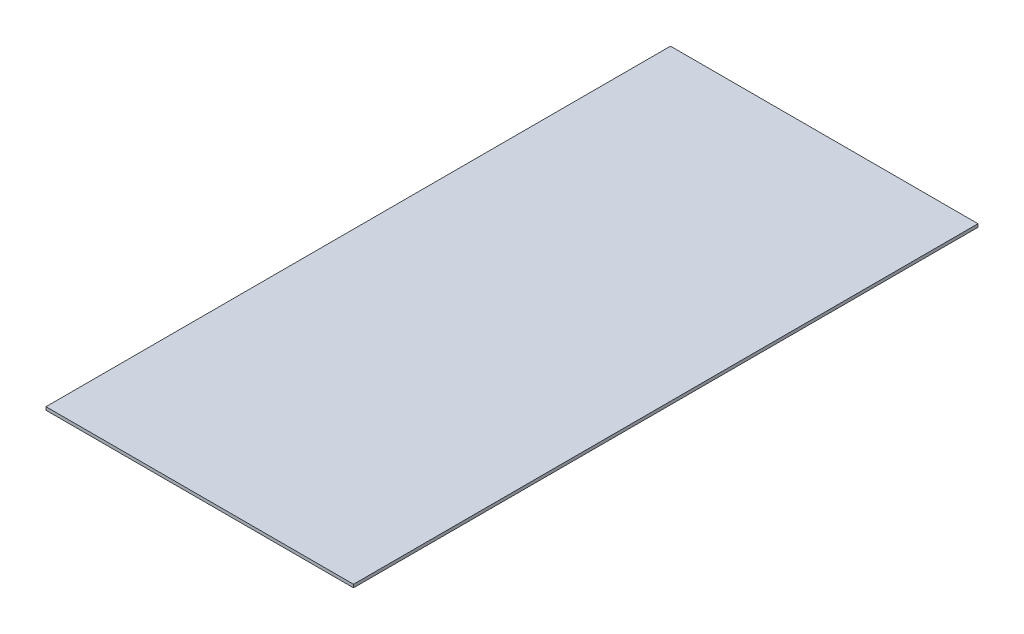
ISO-10303-21;
HEADER;
FILE_DESCRIPTION(('STEP AP214'),'2;1');
FILE_NAME('part.step','',(''),(''),'','','');
FILE_SCHEMA(('AUTOMOTIVE_DESIGN { 1 0 10303 214 1 1 1 1 }'));
ENDSEC;
DATA;
#1=APPLICATION_CONTEXT('core data for automotive mechanical design processes');
#2=APPLICATION_PROTOCOL_DEFINITION('international standard','automotive_design',2000,#1);
#3=PRODUCT_CONTEXT('',#1,'mechanical');
#4=PRODUCT('Part','Part','',(#3));
#5=PRODUCT_RELATED_PRODUCT_CATEGORY('part','',(#4));
#6=PRODUCT_DEFINITION_FORMATION('','',#4);
#7=PRODUCT_DEFINITION_CONTEXT('part definition',#1,'design');
#8=PRODUCT_DEFINITION('design','',#6,#7);
#9=PRODUCT_DEFINITION_SHAPE('','',#8);
#10=(LENGTH_UNIT() NAMED_UNIT(*) SI_UNIT(.MILLI.,.METRE.));
#11=(NAMED_UNIT(*) PLANE_ANGLE_UNIT() SI_UNIT($,.RADIAN.));
#12=(NAMED_UNIT(*) SI_UNIT($,.STERADIAN.) SOLID_ANGLE_UNIT());
#13=UNCERTAINTY_MEASURE_WITH_UNIT(LENGTH_MEASURE(1.E-05),#10,'distance_accuracy_value','');
#14=(GEOMETRIC_REPRESENTATION_CONTEXT(3) GLOBAL_UNCERTAINTY_ASSIGNED_CONTEXT((#13)) GLOBAL_UNIT_ASSIGNED_CONTEXT((#10,
#11,#12)) REPRESENTATION_CONTEXT('',''));
#15=CARTESIAN_POINT('',(0.,0.,0.));
#16=DIRECTION('',(0.,0.,1.));
#17=DIRECTION('',(1.,0.,0.));
#18=AXIS2_PLACEMENT_3D('',#15,#16,#17);
#19=CARTESIAN_POINT('',(-490.,10.,995.));
#20=DIRECTION('',(1.,0.,0.));
#21=DIRECTION('',(0.,0.,-1.));
#22=AXIS2_PLACEMENT_3D('',#19,#20,#21);
#23=PLANE('',#22);
#24=DIRECTION('',(0.,0.,1.));
#25=VECTOR('',#24,1.);
#26=CARTESIAN_POINT('',(-490.,0.,995.));
#27=LINE('',#26,#25);
#28=CARTESIAN_POINT('',(-490.,0.,-995.));
#29=VERTEX_POINT('',#28);
#30=CARTESIAN_POINT('',(-490.,0.,995.));
#31=VERTEX_POINT('',#30);
#32=EDGE_CURVE('E94',#29,#31,#27,.T.);
#33=ORIENTED_EDGE('',*,*,#32,.T.);
#34=DIRECTION('',(0.,-1.,0.));
#35=VECTOR('',#34,1.);
#36=CARTESIAN_POINT('',(-490.,10.,995.));
#37=LINE('',#36,#35);
#38=CARTESIAN_POINT('',(-490.,10.,995.));
#39=VERTEX_POINT('',#38);
#40=EDGE_CURVE('E11',#39,#31,#37,.T.);
#41=ORIENTED_EDGE('',*,*,#40,.F.);
#42=DIRECTION('',(0.,0.,1.));
#43=VECTOR('',#42,1.);
#44=CARTESIAN_POINT('',(-490.,10.,995.));
#45=LINE('',#44,#43);
#46=CARTESIAN_POINT('',(-490.,10.,-995.));
#47=VERTEX_POINT('',#46);
#48=EDGE_CURVE('E82',#47,#39,#45,.T.);
#49=ORIENTED_EDGE('',*,*,#48,.F.);
#50=DIRECTION('',(0.,-1.,0.));
#51=VECTOR('',#50,1.);
#52=CARTESIAN_POINT('',(-490.,10.,-995.));
#53=LINE('',#52,#51);
#54=EDGE_CURVE('E90',#47,#29,#53,.T.);
#55=ORIENTED_EDGE('',*,*,#54,.T.);
#56=EDGE_LOOP('',(#33,#41,#49,#55));
#57=FACE_BOUND('',#56,.T.);
#58=ADVANCED_FACE('F31',(#57),#23,.F.);
#59=CARTESIAN_POINT('',(490.,10.,995.));
#60=DIRECTION('',(0.,0.,-1.));
#61=DIRECTION('',(-1.,0.,0.));
#62=AXIS2_PLACEMENT_3D('',#59,#60,#61);
#63=PLANE('',#62);
#64=DIRECTION('',(1.,0.,0.));
#65=VECTOR('',#64,1.);
#66=CARTESIAN_POINT('',(490.,0.,995.));
#67=LINE('',#66,#65);
#68=CARTESIAN_POINT('',(490.,0.,995.));
#69=VERTEX_POINT('',#68);
#70=EDGE_CURVE('E86',#31,#69,#67,.T.);
#71=ORIENTED_EDGE('',*,*,#70,.T.);
#72=DIRECTION('',(0.,-1.,0.));
#73=VECTOR('',#72,1.);
#74=CARTESIAN_POINT('',(490.,10.,995.));
#75=LINE('',#74,#73);
#76=CARTESIAN_POINT('',(490.,10.,995.));
#77=VERTEX_POINT('',#76);
#78=EDGE_CURVE('E39',#77,#69,#75,.T.);
#79=ORIENTED_EDGE('',*,*,#78,.F.);
#80=DIRECTION('',(1.,0.,0.));
#81=VECTOR('',#80,1.);
#82=CARTESIAN_POINT('',(490.,10.,995.));
#83=LINE('',#82,#81);
#84=EDGE_CURVE('E77',#39,#77,#83,.T.);
#85=ORIENTED_EDGE('',*,*,#84,.F.);
#86=ORIENTED_EDGE('',*,*,#40,.T.);
#87=EDGE_LOOP('',(#71,#79,#85,#86));
#88=FACE_BOUND('',#87,.T.);
#89=ADVANCED_FACE('F85',(#88),#63,.F.);
#90=CARTESIAN_POINT('',(490.,10.,995.));
#91=DIRECTION('',(-1.,0.,0.));
#92=DIRECTION('',(0.,0.,1.));
#93=AXIS2_PLACEMENT_3D('',#90,#91,#92);
#94=PLANE('',#93);
#95=DIRECTION('',(0.,0.,-1.));
#96=VECTOR('',#95,1.);
#97=CARTESIAN_POINT('',(490.,0.,995.));
#98=LINE('',#97,#96);
#99=CARTESIAN_POINT('',(490.,0.,-995.));
#100=VERTEX_POINT('',#99);
#101=EDGE_CURVE('E64',#69,#100,#98,.T.);
#102=ORIENTED_EDGE('',*,*,#101,.T.);
#103=DIRECTION('',(0.,-1.,0.));
#104=VECTOR('',#103,1.);
#105=CARTESIAN_POINT('',(490.,10.,-995.));
#106=LINE('',#105,#104);
#107=CARTESIAN_POINT('',(490.,10.,-995.));
#108=VERTEX_POINT('',#107);
#109=EDGE_CURVE('E87',#108,#100,#106,.T.);
#110=ORIENTED_EDGE('',*,*,#109,.F.);
#111=DIRECTION('',(0.,0.,-1.));
#112=VECTOR('',#111,1.);
#113=CARTESIAN_POINT('',(490.,10.,995.));
#114=LINE('',#113,#112);
#115=EDGE_CURVE('E80',#77,#108,#114,.T.);
#116=ORIENTED_EDGE('',*,*,#115,.F.);
#117=ORIENTED_EDGE('',*,*,#78,.T.);
#118=EDGE_LOOP('',(#102,#110,#116,#117));
#119=FACE_BOUND('',#118,.T.);
#120=ADVANCED_FACE('F88',(#119),#94,.F.);
#121=CARTESIAN_POINT('',(490.,10.,-995.));
#122=DIRECTION('',(0.,0.,1.));
#123=DIRECTION('',(1.,0.,0.));
#124=AXIS2_PLACEMENT_3D('',#121,#122,#123);
#125=PLANE('',#124);
#126=DIRECTION('',(-1.,0.,0.));
#127=VECTOR('',#126,1.);
#128=CARTESIAN_POINT('',(490.,0.,-995.));
#129=LINE('',#128,#127);
#130=EDGE_CURVE('E70',#100,#29,#129,.T.);
#131=ORIENTED_EDGE('',*,*,#130,.T.);
#132=ORIENTED_EDGE('',*,*,#54,.F.);
#133=DIRECTION('',(-1.,0.,0.));
#134=VECTOR('',#133,1.);
#135=CARTESIAN_POINT('',(490.,10.,-995.));
#136=LINE('',#135,#134);
#137=EDGE_CURVE('E47',#108,#47,#136,.T.);
#138=ORIENTED_EDGE('',*,*,#137,.F.);
#139=ORIENTED_EDGE('',*,*,#109,.T.);
#140=EDGE_LOOP('',(#131,#132,#138,#139));
#141=FACE_BOUND('',#140,.T.);
#142=ADVANCED_FACE('F101',(#141),#125,.F.);
#143=CARTESIAN_POINT('',(-490.,10.,-995.));
#144=DIRECTION('',(0.,1.,0.));
#145=DIRECTION('',(0.,0.,1.));
#146=AXIS2_PLACEMENT_3D('',#143,#144,#145);
#147=PLANE('',#146);
#148=ORIENTED_EDGE('',*,*,#48,.T.);
#149=ORIENTED_EDGE('',*,*,#84,.T.);
#150=ORIENTED_EDGE('',*,*,#115,.T.);
#151=ORIENTED_EDGE('',*,*,#137,.T.);
#152=EDGE_LOOP('',(#148,#149,#150,#151));
#153=FACE_BOUND('',#152,.T.);
#154=ADVANCED_FACE('F78',(#153),#147,.T.);
#155=CARTESIAN_POINT('',(-490.,0.,-995.));
#156=DIRECTION('',(0.,1.,0.));
#157=DIRECTION('',(0.,0.,1.));
#158=AXIS2_PLACEMENT_3D('',#155,#156,#157);
#159=PLANE('',#158);
#160=ORIENTED_EDGE('',*,*,#32,.F.);
#161=ORIENTED_EDGE('',*,*,#130,.F.);
#162=ORIENTED_EDGE('',*,*,#101,.F.);
#163=ORIENTED_EDGE('',*,*,#70,.F.);
#164=EDGE_LOOP('',(#160,#161,#162,#163));
#165=FACE_BOUND('',#164,.T.);
#166=ADVANCED_FACE('F104',(#165),#159,.F.);
#167=CLOSED_SHELL('',(#58,#89,#120,#142,#154,#166));
#168=MANIFOLD_SOLID_BREP('B2',#167);
#169=ADVANCED_BREP_SHAPE_REPRESENTATION('',(#18,#168),#14);
#170=SHAPE_DEFINITION_REPRESENTATION(#9,#169);
ENDSEC;
END-ISO-10303-21;
